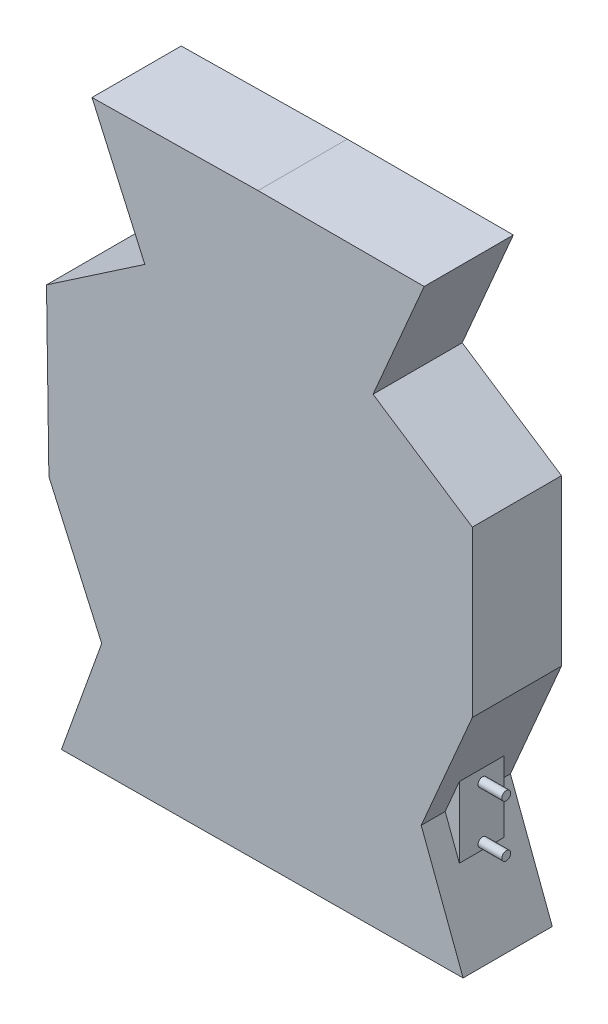
ISO-10303-21;
HEADER;
FILE_DESCRIPTION(('STEP AP214'),'2;1');
FILE_NAME('part.step','',(''),(''),'','','');
FILE_SCHEMA(('AUTOMOTIVE_DESIGN { 1 0 10303 214 1 1 1 1 }'));
ENDSEC;
DATA;
#1=APPLICATION_CONTEXT('core data for automotive mechanical design processes');
#2=APPLICATION_PROTOCOL_DEFINITION('international standard','automotive_design',2000,#1);
#3=PRODUCT_CONTEXT('',#1,'mechanical');
#4=PRODUCT('Part','Part','',(#3));
#5=PRODUCT_RELATED_PRODUCT_CATEGORY('part','',(#4));
#6=PRODUCT_DEFINITION_FORMATION('','',#4);
#7=PRODUCT_DEFINITION_CONTEXT('part definition',#1,'design');
#8=PRODUCT_DEFINITION('design','',#6,#7);
#9=PRODUCT_DEFINITION_SHAPE('','',#8);
#10=(LENGTH_UNIT() NAMED_UNIT(*) SI_UNIT(.MILLI.,.METRE.));
#11=(NAMED_UNIT(*) PLANE_ANGLE_UNIT() SI_UNIT($,.RADIAN.));
#12=(NAMED_UNIT(*) SI_UNIT($,.STERADIAN.) SOLID_ANGLE_UNIT());
#13=UNCERTAINTY_MEASURE_WITH_UNIT(LENGTH_MEASURE(1.E-05),#10,'distance_accuracy_value','');
#14=(GEOMETRIC_REPRESENTATION_CONTEXT(3) GLOBAL_UNCERTAINTY_ASSIGNED_CONTEXT((#13)) GLOBAL_UNIT_ASSIGNED_CONTEXT((#10,
#11,#12)) REPRESENTATION_CONTEXT('',''));
#15=CARTESIAN_POINT('',(0.,0.,0.));
#16=DIRECTION('',(0.,0.,1.));
#17=DIRECTION('',(1.,0.,0.));
#18=AXIS2_PLACEMENT_3D('',#15,#16,#17);
#19=CARTESIAN_POINT('',(19.2258651036182,-108.485610583333,30.));
#20=DIRECTION('',(-0.935884627526308,-0.352306633431652,0.));
#21=DIRECTION('',(0.352306633431652,-0.935884627526308,0.));
#22=AXIS2_PLACEMENT_3D('',#19,#20,#21);
#23=PLANE('',#22);
#24=DIRECTION('',(-0.352306633431652,0.935884627526308,0.));
#25=VECTOR('',#24,1.);
#26=CARTESIAN_POINT('',(19.2258651036182,-108.485610583333,6.94150678656227));
#27=LINE('',#26,#25);
#28=CARTESIAN_POINT('',(24.0000000000001,-121.167856772511,6.94150678656227));
#29=VERTEX_POINT('',#28);
#30=CARTESIAN_POINT('',(19.2258651036182,-108.485610583333,6.94150678656227));
#31=VERTEX_POINT('',#30);
#32=EDGE_CURVE('E231',#29,#31,#27,.T.);
#33=ORIENTED_EDGE('',*,*,#32,.F.);
#34=DIRECTION('',(0.,0.,-1.));
#35=VECTOR('',#34,1.);
#36=CARTESIAN_POINT('',(24.0000000000001,-121.167856772511,30.));
#37=LINE('',#36,#35);
#38=CARTESIAN_POINT('',(24.0000000000001,-121.167856772511,21.9415067865623));
#39=VERTEX_POINT('',#38);
#40=EDGE_CURVE('E217',#39,#29,#37,.T.);
#41=ORIENTED_EDGE('',*,*,#40,.F.);
#42=DIRECTION('',(0.352306633431652,-0.935884627526308,0.));
#43=VECTOR('',#42,1.);
#44=CARTESIAN_POINT('',(19.2258651036182,-108.485610583333,21.9415067865623));
#45=LINE('',#44,#43);
#46=CARTESIAN_POINT('',(19.2258651036182,-108.485610583333,21.9415067865623));
#47=VERTEX_POINT('',#46);
#48=EDGE_CURVE('E225',#47,#39,#45,.T.);
#49=ORIENTED_EDGE('',*,*,#48,.F.);
#50=DIRECTION('',(0.,0.,-1.));
#51=VECTOR('',#50,1.);
#52=CARTESIAN_POINT('',(19.2258651036182,-108.485610583333,30.));
#53=LINE('',#52,#51);
#54=CARTESIAN_POINT('',(19.2258651036182,-108.485610583333,30.));
#55=VERTEX_POINT('',#54);
#56=EDGE_CURVE('E305',#55,#47,#53,.T.);
#57=ORIENTED_EDGE('',*,*,#56,.F.);
#58=DIRECTION('',(-0.352306633431652,0.935884627526308,0.));
#59=VECTOR('',#58,1.);
#60=CARTESIAN_POINT('',(19.2258651036182,-108.485610583333,30.));
#61=LINE('',#60,#59);
#62=CARTESIAN_POINT('',(33.3181304408842,-145.920995684385,30.));
#63=VERTEX_POINT('',#62);
#64=EDGE_CURVE('E250',#63,#55,#61,.T.);
#65=ORIENTED_EDGE('',*,*,#64,.F.);
#66=DIRECTION('',(0.,0.,-1.));
#67=VECTOR('',#66,1.);
#68=CARTESIAN_POINT('',(33.3181304408842,-145.920995684385,30.));
#69=LINE('',#68,#67);
#70=CARTESIAN_POINT('',(33.3181304408842,-145.920995684385,0.));
#71=VERTEX_POINT('',#70);
#72=EDGE_CURVE('E308',#63,#71,#69,.T.);
#73=ORIENTED_EDGE('',*,*,#72,.T.);
#74=DIRECTION('',(-0.352306633431652,0.935884627526308,0.));
#75=VECTOR('',#74,1.);
#76=CARTESIAN_POINT('',(19.2258651036182,-108.485610583333,0.));
#77=LINE('',#76,#75);
#78=CARTESIAN_POINT('',(19.2258651036182,-108.485610583333,0.));
#79=VERTEX_POINT('',#78);
#80=EDGE_CURVE('E278',#71,#79,#77,.T.);
#81=ORIENTED_EDGE('',*,*,#80,.T.);
#82=EDGE_CURVE('E304',#31,#79,#53,.T.);
#83=ORIENTED_EDGE('',*,*,#82,.F.);
#84=EDGE_LOOP('',(#33,#41,#49,#57,#65,#73,#81,#83));
#85=FACE_BOUND('',#84,.T.);
#86=ADVANCED_FACE('F32',(#85),#23,.F.);
#87=CARTESIAN_POINT('',(36.4175876407539,-68.4856105833332,30.));
#88=DIRECTION('',(-0.918738168273325,0.394867291830782,0.));
#89=DIRECTION('',(-0.394867291830782,-0.918738168273325,0.));
#90=AXIS2_PLACEMENT_3D('',#87,#88,#89);
#91=PLANE('',#90);
#92=DIRECTION('',(0.394867291830782,0.918738168273325,0.));
#93=VECTOR('',#92,1.);
#94=CARTESIAN_POINT('',(36.4175876407539,-68.4856105833332,6.94150678656227));
#95=LINE('',#94,#93);
#96=CARTESIAN_POINT('',(24.0000000000001,-97.377625595629,6.94150678656227));
#97=VERTEX_POINT('',#96);
#98=EDGE_CURVE('E184',#31,#97,#95,.T.);
#99=ORIENTED_EDGE('',*,*,#98,.F.);
#100=ORIENTED_EDGE('',*,*,#82,.T.);
#101=DIRECTION('',(0.394867291830782,0.918738168273325,0.));
#102=VECTOR('',#101,1.);
#103=CARTESIAN_POINT('',(36.4175876407539,-68.4856105833332,0.));
#104=LINE('',#103,#102);
#105=CARTESIAN_POINT('',(36.4175876407539,-68.4856105833332,0.));
#106=VERTEX_POINT('',#105);
#107=EDGE_CURVE('E281',#79,#106,#104,.T.);
#108=ORIENTED_EDGE('',*,*,#107,.T.);
#109=DIRECTION('',(0.,0.,-1.));
#110=VECTOR('',#109,1.);
#111=CARTESIAN_POINT('',(36.4175876407539,-68.4856105833332,30.));
#112=LINE('',#111,#110);
#113=CARTESIAN_POINT('',(36.4175876407539,-68.4856105833332,30.));
#114=VERTEX_POINT('',#113);
#115=EDGE_CURVE('E301',#114,#106,#112,.T.);
#116=ORIENTED_EDGE('',*,*,#115,.F.);
#117=DIRECTION('',(0.394867291830782,0.918738168273325,0.));
#118=VECTOR('',#117,1.);
#119=CARTESIAN_POINT('',(36.4175876407539,-68.4856105833332,30.));
#120=LINE('',#119,#118);
#121=EDGE_CURVE('E252',#55,#114,#120,.T.);
#122=ORIENTED_EDGE('',*,*,#121,.F.);
#123=ORIENTED_EDGE('',*,*,#56,.T.);
#124=DIRECTION('',(-0.394867291830782,-0.918738168273325,0.));
#125=VECTOR('',#124,1.);
#126=CARTESIAN_POINT('',(36.4175876407539,-68.4856105833332,21.9415067865623));
#127=LINE('',#126,#125);
#128=CARTESIAN_POINT('',(24.0000000000001,-97.377625595629,21.9415067865623));
#129=VERTEX_POINT('',#128);
#130=EDGE_CURVE('E189',#129,#47,#127,.T.);
#131=ORIENTED_EDGE('',*,*,#130,.F.);
#132=DIRECTION('',(0.,0.,1.));
#133=VECTOR('',#132,1.);
#134=CARTESIAN_POINT('',(24.0000000000001,-97.377625595629,30.));
#135=LINE('',#134,#133);
#136=EDGE_CURVE('E219',#97,#129,#135,.T.);
#137=ORIENTED_EDGE('',*,*,#136,.F.);
#138=EDGE_LOOP('',(#99,#100,#108,#116,#122,#123,#131,#137));
#139=FACE_BOUND('',#138,.T.);
#140=ADVANCED_FACE('F326',(#139),#91,.F.);
#141=CARTESIAN_POINT('',(-91.5246396923902,48.1857808875972,30.));
#142=DIRECTION('',(0.0144687106700426,-0.999895322727107,0.));
#143=DIRECTION('',(0.999895322727108,0.0144687106700426,0.));
#144=AXIS2_PLACEMENT_3D('',#141,#142,#143);
#145=PLANE('',#144);
#146=DIRECTION('',(-0.999895322727107,-0.0144687106700426,0.));
#147=VECTOR('',#146,1.);
#148=CARTESIAN_POINT('',(-91.5246396923902,48.1857808875972,0.));
#149=LINE('',#148,#147);
#150=CARTESIAN_POINT('',(-35.6592204405538,48.9941660947716,0.));
#151=VERTEX_POINT('',#150);
#152=CARTESIAN_POINT('',(-91.5246396923902,48.1857808875972,0.));
#153=VERTEX_POINT('',#152);
#154=EDGE_CURVE('E234',#151,#153,#149,.T.);
#155=ORIENTED_EDGE('',*,*,#154,.T.);
#156=DIRECTION('',(0.,0.,-1.));
#157=VECTOR('',#156,1.);
#158=CARTESIAN_POINT('',(-91.5246396923902,48.1857808875972,30.));
#159=LINE('',#158,#157);
#160=CARTESIAN_POINT('',(-91.5246396923902,48.1857808875972,30.));
#161=VERTEX_POINT('',#160);
#162=EDGE_CURVE('E322',#161,#153,#159,.T.);
#163=ORIENTED_EDGE('',*,*,#162,.F.);
#164=DIRECTION('',(-0.999895322727107,-0.0144687106700426,0.));
#165=VECTOR('',#164,1.);
#166=CARTESIAN_POINT('',(-91.5246396923902,48.1857808875972,30.));
#167=LINE('',#166,#165);
#168=CARTESIAN_POINT('',(-35.6592204405538,48.9941660947716,30.));
#169=VERTEX_POINT('',#168);
#170=EDGE_CURVE('E235',#169,#161,#167,.T.);
#171=ORIENTED_EDGE('',*,*,#170,.F.);
#172=DIRECTION('',(0.,0.,-1.));
#173=VECTOR('',#172,1.);
#174=CARTESIAN_POINT('',(-35.6592204405538,48.9941660947716,30.));
#175=LINE('',#174,#173);
#176=EDGE_CURVE('E262',#169,#151,#175,.T.);
#177=ORIENTED_EDGE('',*,*,#176,.T.);
#178=EDGE_LOOP('',(#155,#163,#171,#177));
#179=FACE_BOUND('',#178,.T.);
#180=ADVANCED_FACE('F34',(#179),#145,.F.);
#181=CARTESIAN_POINT('',(-91.5246396923902,48.1857808875972,30.));
#182=DIRECTION('',(0.912928776668804,0.408118914937791,0.));
#183=DIRECTION('',(-0.408118914937791,0.912928776668805,0.));
#184=AXIS2_PLACEMENT_3D('',#181,#182,#183);
#185=PLANE('',#184);
#186=DIRECTION('',(0.408118914937791,-0.912928776668804,0.));
#187=VECTOR('',#186,1.);
#188=CARTESIAN_POINT('',(-91.5246396923902,48.1857808875972,0.));
#189=LINE('',#188,#187);
#190=CARTESIAN_POINT('',(-73.7559683110842,8.43871003782237,0.));
#191=VERTEX_POINT('',#190);
#192=EDGE_CURVE('E265',#153,#191,#189,.T.);
#193=ORIENTED_EDGE('',*,*,#192,.T.);
#194=DIRECTION('',(0.,0.,-1.));
#195=VECTOR('',#194,1.);
#196=CARTESIAN_POINT('',(-73.7559683110842,8.43871003782237,30.));
#197=LINE('',#196,#195);
#198=CARTESIAN_POINT('',(-73.7559683110842,8.43871003782237,30.));
#199=VERTEX_POINT('',#198);
#200=EDGE_CURVE('E319',#199,#191,#197,.T.);
#201=ORIENTED_EDGE('',*,*,#200,.F.);
#202=DIRECTION('',(0.408118914937791,-0.912928776668804,0.));
#203=VECTOR('',#202,1.);
#204=CARTESIAN_POINT('',(-91.5246396923902,48.1857808875972,30.));
#205=LINE('',#204,#203);
#206=EDGE_CURVE('E238',#161,#199,#205,.T.);
#207=ORIENTED_EDGE('',*,*,#206,.F.);
#208=ORIENTED_EDGE('',*,*,#162,.T.);
#209=EDGE_LOOP('',(#193,#201,#207,#208));
#210=FACE_BOUND('',#209,.T.);
#211=ADVANCED_FACE('F375',(#210),#185,.F.);
#212=CARTESIAN_POINT('',(-73.7559683110842,8.43871003782237,30.));
#213=DIRECTION('',(0.562376540625002,-0.82688126508868,0.));
#214=DIRECTION('',(0.82688126508868,0.562376540625002,0.));
#215=AXIS2_PLACEMENT_3D('',#212,#213,#214);
#216=PLANE('',#215);
#217=DIRECTION('',(-0.82688126508868,-0.562376540625002,0.));
#218=VECTOR('',#217,1.);
#219=CARTESIAN_POINT('',(-73.7559683110842,8.43871003782237,0.));
#220=LINE('',#219,#218);
#221=CARTESIAN_POINT('',(-106.831218914631,-14.0563515871777,0.));
#222=VERTEX_POINT('',#221);
#223=EDGE_CURVE('E267',#191,#222,#220,.T.);
#224=ORIENTED_EDGE('',*,*,#223,.T.);
#225=DIRECTION('',(0.,0.,-1.));
#226=VECTOR('',#225,1.);
#227=CARTESIAN_POINT('',(-106.831218914631,-14.0563515871777,30.));
#228=LINE('',#227,#226);
#229=CARTESIAN_POINT('',(-106.831218914631,-14.0563515871777,30.));
#230=VERTEX_POINT('',#229);
#231=EDGE_CURVE('E316',#230,#222,#228,.T.);
#232=ORIENTED_EDGE('',*,*,#231,.F.);
#233=DIRECTION('',(-0.82688126508868,-0.562376540625002,0.));
#234=VECTOR('',#233,1.);
#235=CARTESIAN_POINT('',(-73.7559683110842,8.43871003782237,30.));
#236=LINE('',#235,#234);
#237=EDGE_CURVE('E241',#199,#230,#236,.T.);
#238=ORIENTED_EDGE('',*,*,#237,.F.);
#239=ORIENTED_EDGE('',*,*,#200,.T.);
#240=EDGE_LOOP('',(#224,#232,#238,#239));
#241=FACE_BOUND('',#240,.T.);
#242=ADVANCED_FACE('F371',(#241),#216,.F.);
#243=CARTESIAN_POINT('',(-106.831218914631,-14.0563515871777,30.));
#244=DIRECTION('',(0.999895322727108,0.0144687106700407,0.));
#245=DIRECTION('',(-0.0144687106700407,0.999895322727108,0.));
#246=AXIS2_PLACEMENT_3D('',#243,#244,#245);
#247=PLANE('',#246);
#248=DIRECTION('',(0.0144687106700407,-0.999895322727108,0.));
#249=VECTOR('',#248,1.);
#250=CARTESIAN_POINT('',(-106.831218914631,-14.0563515871777,0.));
#251=LINE('',#250,#249);
#252=CARTESIAN_POINT('',(-106.028702819816,-69.5161716028391,0.));
#253=VERTEX_POINT('',#252);
#254=EDGE_CURVE('E269',#222,#253,#251,.T.);
#255=ORIENTED_EDGE('',*,*,#254,.T.);
#256=DIRECTION('',(0.,0.,-1.));
#257=VECTOR('',#256,1.);
#258=CARTESIAN_POINT('',(-106.028702819816,-69.5161716028391,30.));
#259=LINE('',#258,#257);
#260=CARTESIAN_POINT('',(-106.028702819816,-69.5161716028391,30.));
#261=VERTEX_POINT('',#260);
#262=EDGE_CURVE('E171',#261,#253,#259,.T.);
#263=ORIENTED_EDGE('',*,*,#262,.F.);
#264=DIRECTION('',(0.0144687106700407,-0.999895322727108,0.));
#265=VECTOR('',#264,1.);
#266=CARTESIAN_POINT('',(-106.831218914631,-14.0563515871777,30.));
#267=LINE('',#266,#265);
#268=EDGE_CURVE('E243',#230,#261,#267,.T.);
#269=ORIENTED_EDGE('',*,*,#268,.F.);
#270=ORIENTED_EDGE('',*,*,#231,.T.);
#271=EDGE_LOOP('',(#255,#263,#269,#270));
#272=FACE_BOUND('',#271,.T.);
#273=ADVANCED_FACE('F367',(#272),#247,.F.);
#274=CARTESIAN_POINT('',(-106.028702819816,-69.5161716028391,30.));
#275=DIRECTION('',(0.912928776668805,0.408118914937791,0.));
#276=DIRECTION('',(-0.408118914937791,0.912928776668805,0.));
#277=AXIS2_PLACEMENT_3D('',#274,#275,#276);
#278=PLANE('',#277);
#279=DIRECTION('',(0.,0.,-1.));
#280=VECTOR('',#279,1.);
#281=CARTESIAN_POINT('',(-88.2600314385101,-109.263242452614,30.));
#282=LINE('',#281,#280);
#283=CARTESIAN_POINT('',(-88.2600314385101,-109.263242452614,5.));
#284=VERTEX_POINT('',#283);
#285=CARTESIAN_POINT('',(-88.2600314385101,-109.263242452614,0.));
#286=VERTEX_POINT('',#285);
#287=EDGE_CURVE('E172',#284,#286,#282,.T.);
#288=ORIENTED_EDGE('',*,*,#287,.F.);
#289=DIRECTION('',(-0.408118914937791,0.912928776668805,0.));
#290=VECTOR('',#289,1.);
#291=CARTESIAN_POINT('',(-106.028702819816,-69.5161716028391,5.));
#292=LINE('',#291,#290);
#293=CARTESIAN_POINT('',(-92.4910494391389,-99.7987997473144,5.));
#294=VERTEX_POINT('',#293);
#295=EDGE_CURVE('E47',#284,#294,#292,.T.);
#296=ORIENTED_EDGE('',*,*,#295,.T.);
#297=DIRECTION('',(0.,0.,-1.));
#298=VECTOR('',#297,1.);
#299=CARTESIAN_POINT('',(-92.4910494391389,-99.7987997473144,30.));
#300=LINE('',#299,#298);
#301=CARTESIAN_POINT('',(-92.4910494391389,-99.7987997473144,25.));
#302=VERTEX_POINT('',#301);
#303=EDGE_CURVE('E51',#302,#294,#300,.T.);
#304=ORIENTED_EDGE('',*,*,#303,.F.);
#305=DIRECTION('',(-0.408118914937791,0.912928776668805,0.));
#306=VECTOR('',#305,1.);
#307=CARTESIAN_POINT('',(-106.028702819816,-69.5161716028391,25.));
#308=LINE('',#307,#306);
#309=CARTESIAN_POINT('',(-88.2600314385101,-109.263242452614,25.));
#310=VERTEX_POINT('',#309);
#311=EDGE_CURVE('E174',#310,#302,#308,.T.);
#312=ORIENTED_EDGE('',*,*,#311,.F.);
#313=CARTESIAN_POINT('',(-88.2600314385101,-109.263242452614,30.));
#314=VERTEX_POINT('',#313);
#315=EDGE_CURVE('E163',#314,#310,#282,.T.);
#316=ORIENTED_EDGE('',*,*,#315,.F.);
#317=DIRECTION('',(0.408118914937791,-0.912928776668805,0.));
#318=VECTOR('',#317,1.);
#319=CARTESIAN_POINT('',(-106.028702819816,-69.5161716028391,30.));
#320=LINE('',#319,#318);
#321=EDGE_CURVE('E245',#261,#314,#320,.T.);
#322=ORIENTED_EDGE('',*,*,#321,.F.);
#323=ORIENTED_EDGE('',*,*,#262,.T.);
#324=DIRECTION('',(0.408118914937791,-0.912928776668805,0.));
#325=VECTOR('',#324,1.);
#326=CARTESIAN_POINT('',(-106.028702819816,-69.5161716028391,0.));
#327=LINE('',#326,#325);
#328=EDGE_CURVE('E271',#253,#286,#327,.T.);
#329=ORIENTED_EDGE('',*,*,#328,.T.);
#330=EDGE_LOOP('',(#288,#296,#304,#312,#316,#322,#323,#329));
#331=FACE_BOUND('',#330,.T.);
#332=ADVANCED_FACE('F175',(#331),#278,.F.);
#333=CARTESIAN_POINT('',(-88.2600314385101,-109.263242452614,30.));
#334=DIRECTION('',(0.940884084422016,-0.338728711037824,0.));
#335=DIRECTION('',(0.338728711037824,0.940884084422016,0.));
#336=AXIS2_PLACEMENT_3D('',#333,#334,#335);
#337=PLANE('',#336);
#338=DIRECTION('',(0.,0.,1.));
#339=VECTOR('',#338,1.);
#340=CARTESIAN_POINT('',(-92.4910494391389,-121.015707974352,30.));
#341=LINE('',#340,#339);
#342=CARTESIAN_POINT('',(-92.4910494391389,-121.015707974352,5.));
#343=VERTEX_POINT('',#342);
#344=CARTESIAN_POINT('',(-92.4910494391389,-121.015707974352,25.));
#345=VERTEX_POINT('',#344);
#346=EDGE_CURVE('E183',#343,#345,#341,.T.);
#347=ORIENTED_EDGE('',*,*,#346,.F.);
#348=DIRECTION('',(0.338728711037824,0.940884084422016,0.));
#349=VECTOR('',#348,1.);
#350=CARTESIAN_POINT('',(-88.2600314385101,-109.263242452614,5.));
#351=LINE('',#350,#349);
#352=EDGE_CURVE('E186',#343,#284,#351,.T.);
#353=ORIENTED_EDGE('',*,*,#352,.T.);
#354=ORIENTED_EDGE('',*,*,#287,.T.);
#355=DIRECTION('',(-0.338728711037824,-0.940884084422016,0.));
#356=VECTOR('',#355,1.);
#357=CARTESIAN_POINT('',(-88.2600314385101,-109.263242452614,0.));
#358=LINE('',#357,#356);
#359=CARTESIAN_POINT('',(-101.809179880023,-146.898605829495,0.));
#360=VERTEX_POINT('',#359);
#361=EDGE_CURVE('E274',#286,#360,#358,.T.);
#362=ORIENTED_EDGE('',*,*,#361,.T.);
#363=DIRECTION('',(0.,0.,-1.));
#364=VECTOR('',#363,1.);
#365=CARTESIAN_POINT('',(-101.809179880023,-146.898605829495,30.));
#366=LINE('',#365,#364);
#367=CARTESIAN_POINT('',(-101.809179880023,-146.898605829495,30.));
#368=VERTEX_POINT('',#367);
#369=EDGE_CURVE('E311',#368,#360,#366,.T.);
#370=ORIENTED_EDGE('',*,*,#369,.F.);
#371=DIRECTION('',(-0.338728711037824,-0.940884084422016,0.));
#372=VECTOR('',#371,1.);
#373=CARTESIAN_POINT('',(-88.2600314385101,-109.263242452614,30.));
#374=LINE('',#373,#372);
#375=EDGE_CURVE('E169',#314,#368,#374,.T.);
#376=ORIENTED_EDGE('',*,*,#375,.F.);
#377=ORIENTED_EDGE('',*,*,#315,.T.);
#378=DIRECTION('',(0.338728711037824,0.940884084422016,0.));
#379=VECTOR('',#378,1.);
#380=CARTESIAN_POINT('',(-88.2600314385101,-109.263242452614,25.));
#381=LINE('',#380,#379);
#382=EDGE_CURVE('E166',#345,#310,#381,.T.);
#383=ORIENTED_EDGE('',*,*,#382,.F.);
#384=EDGE_LOOP('',(#347,#353,#354,#362,#370,#376,#377,#383));
#385=FACE_BOUND('',#384,.T.);
#386=ADVANCED_FACE('F164',(#385),#337,.F.);
#387=CARTESIAN_POINT('',(-101.809179880023,-146.898605829495,30.));
#388=DIRECTION('',(-0.00723454466060004,0.999973830339351,0.));
#389=DIRECTION('',(-0.999973830339351,-0.00723454466060004,0.));
#390=AXIS2_PLACEMENT_3D('',#387,#388,#389);
#391=PLANE('',#390);
#392=DIRECTION('',(0.999973830339351,0.00723454466060004,0.));
#393=VECTOR('',#392,1.);
#394=CARTESIAN_POINT('',(-101.809179880023,-146.898605829495,0.));
#395=LINE('',#394,#393);
#396=EDGE_CURVE('E276',#360,#71,#395,.T.);
#397=ORIENTED_EDGE('',*,*,#396,.T.);
#398=ORIENTED_EDGE('',*,*,#72,.F.);
#399=DIRECTION('',(0.999973830339351,0.00723454466060004,0.));
#400=VECTOR('',#399,1.);
#401=CARTESIAN_POINT('',(-101.809179880023,-146.898605829495,30.));
#402=LINE('',#401,#400);
#403=EDGE_CURVE('E248',#368,#63,#402,.T.);
#404=ORIENTED_EDGE('',*,*,#403,.F.);
#405=ORIENTED_EDGE('',*,*,#369,.T.);
#406=EDGE_LOOP('',(#397,#398,#404,#405));
#407=FACE_BOUND('',#406,.T.);
#408=ADVANCED_FACE('F359',(#407),#391,.F.);
#409=CARTESIAN_POINT('',(36.4175876407538,-13.0199845772022,30.));
#410=DIRECTION('',(-1.,0.,0.));
#411=DIRECTION('',(0.,-1.,0.));
#412=AXIS2_PLACEMENT_3D('',#409,#410,#411);
#413=PLANE('',#412);
#414=DIRECTION('',(0.,1.,0.));
#415=VECTOR('',#414,1.);
#416=CARTESIAN_POINT('',(36.4175876407538,-13.0199845772022,0.));
#417=LINE('',#416,#415);
#418=CARTESIAN_POINT('',(36.4175876407538,-13.0199845772022,0.));
#419=VERTEX_POINT('',#418);
#420=EDGE_CURVE('E283',#106,#419,#417,.T.);
#421=ORIENTED_EDGE('',*,*,#420,.T.);
#422=DIRECTION('',(0.,0.,-1.));
#423=VECTOR('',#422,1.);
#424=CARTESIAN_POINT('',(36.4175876407538,-13.0199845772022,30.));
#425=LINE('',#424,#423);
#426=CARTESIAN_POINT('',(36.4175876407538,-13.0199845772022,30.));
#427=VERTEX_POINT('',#426);
#428=EDGE_CURVE('E298',#427,#419,#425,.T.);
#429=ORIENTED_EDGE('',*,*,#428,.F.);
#430=DIRECTION('',(0.,1.,0.));
#431=VECTOR('',#430,1.);
#432=CARTESIAN_POINT('',(36.4175876407538,-13.0199845772022,30.));
#433=LINE('',#432,#431);
#434=EDGE_CURVE('E254',#114,#427,#433,.T.);
#435=ORIENTED_EDGE('',*,*,#434,.F.);
#436=ORIENTED_EDGE('',*,*,#115,.T.);
#437=EDGE_LOOP('',(#421,#429,#435,#436));
#438=FACE_BOUND('',#437,.T.);
#439=ADVANCED_FACE('F347',(#438),#413,.F.);
#440=CARTESIAN_POINT('',(3.02032472608309,8.99416609477159,30.));
#441=DIRECTION('',(-0.550353766799344,-0.834931572866767,0.));
#442=DIRECTION('',(0.834931572866767,-0.550353766799344,0.));
#443=AXIS2_PLACEMENT_3D('',#440,#441,#442);
#444=PLANE('',#443);
#445=DIRECTION('',(-0.834931572866767,0.550353766799344,0.));
#446=VECTOR('',#445,1.);
#447=CARTESIAN_POINT('',(3.02032472608309,8.99416609477159,0.));
#448=LINE('',#447,#446);
#449=CARTESIAN_POINT('',(3.02032472608309,8.99416609477159,0.));
#450=VERTEX_POINT('',#449);
#451=EDGE_CURVE('E285',#419,#450,#448,.T.);
#452=ORIENTED_EDGE('',*,*,#451,.T.);
#453=DIRECTION('',(0.,0.,-1.));
#454=VECTOR('',#453,1.);
#455=CARTESIAN_POINT('',(3.02032472608309,8.99416609477159,30.));
#456=LINE('',#455,#454);
#457=CARTESIAN_POINT('',(3.02032472608309,8.99416609477159,30.));
#458=VERTEX_POINT('',#457);
#459=EDGE_CURVE('E295',#458,#450,#456,.T.);
#460=ORIENTED_EDGE('',*,*,#459,.F.);
#461=DIRECTION('',(-0.834931572866767,0.550353766799344,0.));
#462=VECTOR('',#461,1.);
#463=CARTESIAN_POINT('',(3.02032472608309,8.99416609477159,30.));
#464=LINE('',#463,#462);
#465=EDGE_CURVE('E256',#427,#458,#464,.T.);
#466=ORIENTED_EDGE('',*,*,#465,.F.);
#467=ORIENTED_EDGE('',*,*,#428,.T.);
#468=EDGE_LOOP('',(#452,#460,#466,#467));
#469=FACE_BOUND('',#468,.T.);
#470=ADVANCED_FACE('F351',(#469),#444,.F.);
#471=CARTESIAN_POINT('',(20.2120472632188,48.9941660947716,30.));
#472=DIRECTION('',(-0.918738168273324,0.394867291830783,0.));
#473=DIRECTION('',(-0.394867291830783,-0.918738168273325,0.));
#474=AXIS2_PLACEMENT_3D('',#471,#472,#473);
#475=PLANE('',#474);
#476=DIRECTION('',(0.394867291830783,0.918738168273324,0.));
#477=VECTOR('',#476,1.);
#478=CARTESIAN_POINT('',(20.2120472632188,48.9941660947716,0.));
#479=LINE('',#478,#477);
#480=CARTESIAN_POINT('',(20.2120472632188,48.9941660947716,0.));
#481=VERTEX_POINT('',#480);
#482=EDGE_CURVE('E287',#450,#481,#479,.T.);
#483=ORIENTED_EDGE('',*,*,#482,.T.);
#484=DIRECTION('',(0.,0.,-1.));
#485=VECTOR('',#484,1.);
#486=CARTESIAN_POINT('',(20.2120472632188,48.9941660947716,30.));
#487=LINE('',#486,#485);
#488=CARTESIAN_POINT('',(20.2120472632188,48.9941660947716,30.));
#489=VERTEX_POINT('',#488);
#490=EDGE_CURVE('E292',#489,#481,#487,.T.);
#491=ORIENTED_EDGE('',*,*,#490,.F.);
#492=DIRECTION('',(0.394867291830783,0.918738168273324,0.));
#493=VECTOR('',#492,1.);
#494=CARTESIAN_POINT('',(20.2120472632188,48.9941660947716,30.));
#495=LINE('',#494,#493);
#496=EDGE_CURVE('E258',#458,#489,#495,.T.);
#497=ORIENTED_EDGE('',*,*,#496,.F.);
#498=ORIENTED_EDGE('',*,*,#459,.T.);
#499=EDGE_LOOP('',(#483,#491,#497,#498));
#500=FACE_BOUND('',#499,.T.);
#501=ADVANCED_FACE('F385',(#500),#475,.F.);
#502=CARTESIAN_POINT('',(-35.6592204405538,48.9941660947716,30.));
#503=DIRECTION('',(0.,-1.,0.));
#504=DIRECTION('',(0.,0.,-1.));
#505=AXIS2_PLACEMENT_3D('',#502,#503,#504);
#506=PLANE('',#505);
#507=DIRECTION('',(-1.,0.,0.));
#508=VECTOR('',#507,1.);
#509=CARTESIAN_POINT('',(-35.6592204405538,48.9941660947716,0.));
#510=LINE('',#509,#508);
#511=EDGE_CURVE('E239',#481,#151,#510,.T.);
#512=ORIENTED_EDGE('',*,*,#511,.T.);
#513=ORIENTED_EDGE('',*,*,#176,.F.);
#514=DIRECTION('',(-1.,0.,0.));
#515=VECTOR('',#514,1.);
#516=CARTESIAN_POINT('',(-35.6592204405538,48.9941660947716,30.));
#517=LINE('',#516,#515);
#518=EDGE_CURVE('E260',#489,#169,#517,.T.);
#519=ORIENTED_EDGE('',*,*,#518,.F.);
#520=ORIENTED_EDGE('',*,*,#490,.T.);
#521=EDGE_LOOP('',(#512,#513,#519,#520));
#522=FACE_BOUND('',#521,.T.);
#523=ADVANCED_FACE('F382',(#522),#506,.F.);
#524=CARTESIAN_POINT('',(0.,0.,30.));
#525=DIRECTION('',(0.,0.,-1.));
#526=DIRECTION('',(-1.,0.,0.));
#527=AXIS2_PLACEMENT_3D('',#524,#525,#526);
#528=PLANE('',#527);
#529=ORIENTED_EDGE('',*,*,#170,.T.);
#530=ORIENTED_EDGE('',*,*,#206,.T.);
#531=ORIENTED_EDGE('',*,*,#237,.T.);
#532=ORIENTED_EDGE('',*,*,#268,.T.);
#533=ORIENTED_EDGE('',*,*,#321,.T.);
#534=ORIENTED_EDGE('',*,*,#375,.T.);
#535=ORIENTED_EDGE('',*,*,#403,.T.);
#536=ORIENTED_EDGE('',*,*,#64,.T.);
#537=ORIENTED_EDGE('',*,*,#121,.T.);
#538=ORIENTED_EDGE('',*,*,#434,.T.);
#539=ORIENTED_EDGE('',*,*,#465,.T.);
#540=ORIENTED_EDGE('',*,*,#496,.T.);
#541=ORIENTED_EDGE('',*,*,#518,.T.);
#542=EDGE_LOOP('',(#529,#530,#531,#532,#533,#534,#535,#536,#537,#538,#539,#540,#541));
#543=FACE_BOUND('',#542,.T.);
#544=ADVANCED_FACE('F355',(#543),#528,.F.);
#545=CARTESIAN_POINT('',(0.,0.,0.));
#546=DIRECTION('',(0.,0.,-1.));
#547=DIRECTION('',(-1.,0.,0.));
#548=AXIS2_PLACEMENT_3D('',#545,#546,#547);
#549=PLANE('',#548);
#550=ORIENTED_EDGE('',*,*,#154,.F.);
#551=ORIENTED_EDGE('',*,*,#511,.F.);
#552=ORIENTED_EDGE('',*,*,#482,.F.);
#553=ORIENTED_EDGE('',*,*,#451,.F.);
#554=ORIENTED_EDGE('',*,*,#420,.F.);
#555=ORIENTED_EDGE('',*,*,#107,.F.);
#556=ORIENTED_EDGE('',*,*,#80,.F.);
#557=ORIENTED_EDGE('',*,*,#396,.F.);
#558=ORIENTED_EDGE('',*,*,#361,.F.);
#559=ORIENTED_EDGE('',*,*,#328,.F.);
#560=ORIENTED_EDGE('',*,*,#254,.F.);
#561=ORIENTED_EDGE('',*,*,#223,.F.);
#562=ORIENTED_EDGE('',*,*,#192,.F.);
#563=EDGE_LOOP('',(#550,#551,#552,#553,#554,#555,#556,#557,#558,#559,#560,#561,#562));
#564=FACE_BOUND('',#563,.T.);
#565=ADVANCED_FACE('F342',(#564),#549,.T.);
#566=CARTESIAN_POINT('',(24.0000000000001,-93.5713704018408,6.94150678656227));
#567=DIRECTION('',(0.,0.,1.));
#568=DIRECTION('',(0.,-1.,0.));
#569=AXIS2_PLACEMENT_3D('',#566,#567,#568);
#570=PLANE('',#569);
#571=DIRECTION('',(0.,1.,0.));
#572=VECTOR('',#571,1.);
#573=CARTESIAN_POINT('',(24.0000000000001,-93.5713704018408,6.94150678656227));
#574=LINE('',#573,#572);
#575=EDGE_CURVE('E223',#29,#97,#574,.T.);
#576=ORIENTED_EDGE('',*,*,#575,.F.);
#577=ORIENTED_EDGE('',*,*,#32,.T.);
#578=ORIENTED_EDGE('',*,*,#98,.T.);
#579=EDGE_LOOP('',(#576,#577,#578));
#580=FACE_BOUND('',#579,.T.);
#581=ADVANCED_FACE('F334',(#580),#570,.F.);
#582=CARTESIAN_POINT('',(24.0000000000001,-93.5713704018408,21.9415067865623));
#583=DIRECTION('',(0.,0.,-1.));
#584=DIRECTION('',(0.,1.,0.));
#585=AXIS2_PLACEMENT_3D('',#582,#583,#584);
#586=PLANE('',#585);
#587=ORIENTED_EDGE('',*,*,#130,.T.);
#588=ORIENTED_EDGE('',*,*,#48,.T.);
#589=DIRECTION('',(0.,-1.,0.));
#590=VECTOR('',#589,1.);
#591=CARTESIAN_POINT('',(24.0000000000001,-93.5713704018408,21.9415067865623));
#592=LINE('',#591,#590);
#593=EDGE_CURVE('E215',#129,#39,#592,.T.);
#594=ORIENTED_EDGE('',*,*,#593,.F.);
#595=EDGE_LOOP('',(#587,#588,#594));
#596=FACE_BOUND('',#595,.T.);
#597=ADVANCED_FACE('F208',(#596),#586,.F.);
#598=CARTESIAN_POINT('',(24.0000000000001,0.,0.));
#599=DIRECTION('',(-1.,0.,0.));
#600=DIRECTION('',(0.,0.,1.));
#601=AXIS2_PLACEMENT_3D('',#598,#599,#600);
#602=PLANE('',#601);
#603=CARTESIAN_POINT('',(24.0000000000001,-101.373718374154,14.163706184612));
#604=DIRECTION('',(-1.,0.,0.));
#605=DIRECTION('',(0.,0.,1.));
#606=AXIS2_PLACEMENT_3D('',#603,#604,#605);
#607=CIRCLE('',#606,1.5);
#608=CARTESIAN_POINT('',(24.0000000000001,-101.373718374154,15.6637061846121));
#609=VERTEX_POINT('',#608);
#610=EDGE_CURVE('E11',#609,#609,#607,.F.);
#611=ORIENTED_EDGE('',*,*,#610,.F.);
#612=EDGE_LOOP('',(#611));
#613=FACE_BOUND('',#612,.T.);
#614=CARTESIAN_POINT('',(24.0000000000001,-118.873718374154,14.163706184612));
#615=DIRECTION('',(-1.,0.,0.));
#616=DIRECTION('',(0.,0.,1.));
#617=AXIS2_PLACEMENT_3D('',#614,#615,#616);
#618=CIRCLE('',#617,1.5);
#619=CARTESIAN_POINT('',(24.0000000000001,-118.873718374154,15.6637061846121));
#620=VERTEX_POINT('',#619);
#621=EDGE_CURVE('E40',#620,#620,#618,.F.);
#622=ORIENTED_EDGE('',*,*,#621,.F.);
#623=EDGE_LOOP('',(#622));
#624=FACE_BOUND('',#623,.T.);
#625=ORIENTED_EDGE('',*,*,#593,.T.);
#626=ORIENTED_EDGE('',*,*,#40,.T.);
#627=ORIENTED_EDGE('',*,*,#575,.T.);
#628=ORIENTED_EDGE('',*,*,#136,.T.);
#629=EDGE_LOOP('',(#625,#626,#627,#628));
#630=FACE_BOUND('',#629,.T.);
#631=ADVANCED_FACE('F204',(#613,#624,#630),#602,.F.);
#632=CARTESIAN_POINT('',(-92.4910494391389,-121.167856772511,5.));
#633=DIRECTION('',(1.,0.,0.));
#634=DIRECTION('',(0.,0.,-1.));
#635=AXIS2_PLACEMENT_3D('',#632,#633,#634);
#636=PLANE('',#635);
#637=CARTESIAN_POINT('',(-92.4910494391389,-118.873718374154,14.163706184612));
#638=DIRECTION('',(1.,0.,0.));
#639=DIRECTION('',(0.,0.,-1.));
#640=AXIS2_PLACEMENT_3D('',#637,#638,#639);
#641=CIRCLE('',#640,1.5);
#642=CARTESIAN_POINT('',(-92.4910494391389,-118.873718374154,12.663706184612));
#643=VERTEX_POINT('',#642);
#644=EDGE_CURVE('E197',#643,#643,#641,.F.);
#645=ORIENTED_EDGE('',*,*,#644,.F.);
#646=EDGE_LOOP('',(#645));
#647=FACE_BOUND('',#646,.T.);
#648=CARTESIAN_POINT('',(-92.4910494391389,-101.373718374154,14.163706184612));
#649=DIRECTION('',(1.,0.,0.));
#650=DIRECTION('',(0.,0.,-1.));
#651=AXIS2_PLACEMENT_3D('',#648,#649,#650);
#652=CIRCLE('',#651,1.5);
#653=CARTESIAN_POINT('',(-92.4910494391389,-101.373718374154,12.663706184612));
#654=VERTEX_POINT('',#653);
#655=EDGE_CURVE('E194',#654,#654,#652,.F.);
#656=ORIENTED_EDGE('',*,*,#655,.F.);
#657=EDGE_LOOP('',(#656));
#658=FACE_BOUND('',#657,.T.);
#659=DIRECTION('',(0.,1.,0.));
#660=VECTOR('',#659,1.);
#661=CARTESIAN_POINT('',(-92.4910494391389,-121.167856772511,25.));
#662=LINE('',#661,#660);
#663=EDGE_CURVE('E182',#345,#302,#662,.T.);
#664=ORIENTED_EDGE('',*,*,#663,.T.);
#665=ORIENTED_EDGE('',*,*,#303,.T.);
#666=DIRECTION('',(0.,1.,0.));
#667=VECTOR('',#666,1.);
#668=CARTESIAN_POINT('',(-92.4910494391389,-121.167856772511,5.));
#669=LINE('',#668,#667);
#670=EDGE_CURVE('E179',#343,#294,#669,.T.);
#671=ORIENTED_EDGE('',*,*,#670,.F.);
#672=ORIENTED_EDGE('',*,*,#346,.T.);
#673=EDGE_LOOP('',(#664,#665,#671,#672));
#674=FACE_BOUND('',#673,.T.);
#675=ADVANCED_FACE('F207',(#647,#658,#674),#636,.F.);
#676=CARTESIAN_POINT('',(0.,0.,5.));
#677=DIRECTION('',(0.,0.,-1.));
#678=DIRECTION('',(-1.,0.,0.));
#679=AXIS2_PLACEMENT_3D('',#676,#677,#678);
#680=PLANE('',#679);
#681=ORIENTED_EDGE('',*,*,#295,.F.);
#682=ORIENTED_EDGE('',*,*,#352,.F.);
#683=ORIENTED_EDGE('',*,*,#670,.T.);
#684=EDGE_LOOP('',(#681,#682,#683));
#685=FACE_BOUND('',#684,.T.);
#686=ADVANCED_FACE('F462',(#685),#680,.T.);
#687=CARTESIAN_POINT('',(0.,0.,25.));
#688=DIRECTION('',(0.,0.,-1.));
#689=DIRECTION('',(-1.,0.,0.));
#690=AXIS2_PLACEMENT_3D('',#687,#688,#689);
#691=PLANE('',#690);
#692=ORIENTED_EDGE('',*,*,#382,.T.);
#693=ORIENTED_EDGE('',*,*,#311,.T.);
#694=ORIENTED_EDGE('',*,*,#663,.F.);
#695=EDGE_LOOP('',(#692,#693,#694));
#696=FACE_BOUND('',#695,.T.);
#697=ADVANCED_FACE('F181',(#696),#691,.F.);
#698=CARTESIAN_POINT('',(-100.491049439139,-101.373718374154,14.163706184612));
#699=DIRECTION('',(1.,0.,0.));
#700=DIRECTION('',(0.,0.,-1.));
#701=AXIS2_PLACEMENT_3D('',#698,#699,#700);
#702=CYLINDRICAL_SURFACE('',#701,1.5);
#703=CARTESIAN_POINT('',(-100.491049439139,-101.373718374154,14.163706184612));
#704=DIRECTION('',(-1.,0.,0.));
#705=DIRECTION('',(0.,0.,1.));
#706=AXIS2_PLACEMENT_3D('',#703,#704,#705);
#707=CIRCLE('',#706,1.5);
#708=CARTESIAN_POINT('',(-100.491049439139,-101.373718374154,15.6637061846121));
#709=VERTEX_POINT('',#708);
#710=EDGE_CURVE('E641',#709,#709,#707,.T.);
#711=ORIENTED_EDGE('',*,*,#710,.F.);
#712=EDGE_LOOP('',(#711));
#713=FACE_BOUND('',#712,.T.);
#714=ORIENTED_EDGE('',*,*,#655,.T.);
#715=EDGE_LOOP('',(#714));
#716=FACE_BOUND('',#715,.T.);
#717=ADVANCED_FACE('F478',(#713,#716),#702,.T.);
#718=CARTESIAN_POINT('',(-100.491049439139,-101.373718374154,14.163706184612));
#719=DIRECTION('',(-1.,0.,0.));
#720=DIRECTION('',(0.,0.,1.));
#721=AXIS2_PLACEMENT_3D('',#718,#719,#720);
#722=PLANE('',#721);
#723=ORIENTED_EDGE('',*,*,#710,.T.);
#724=EDGE_LOOP('',(#723));
#725=FACE_BOUND('',#724,.T.);
#726=ADVANCED_FACE('F494',(#725),#722,.T.);
#727=CARTESIAN_POINT('',(-100.491049439139,-118.873718374154,14.163706184612));
#728=DIRECTION('',(1.,0.,0.));
#729=DIRECTION('',(0.,0.,-1.));
#730=AXIS2_PLACEMENT_3D('',#727,#728,#729);
#731=CYLINDRICAL_SURFACE('',#730,1.5);
#732=CARTESIAN_POINT('',(-100.491049439139,-118.873718374154,14.163706184612));
#733=DIRECTION('',(-1.,0.,0.));
#734=DIRECTION('',(0.,0.,1.));
#735=AXIS2_PLACEMENT_3D('',#732,#733,#734);
#736=CIRCLE('',#735,1.5);
#737=CARTESIAN_POINT('',(-100.491049439139,-118.873718374154,15.6637061846121));
#738=VERTEX_POINT('',#737);
#739=EDGE_CURVE('E636',#738,#738,#736,.T.);
#740=ORIENTED_EDGE('',*,*,#739,.F.);
#741=EDGE_LOOP('',(#740));
#742=FACE_BOUND('',#741,.T.);
#743=ORIENTED_EDGE('',*,*,#644,.T.);
#744=EDGE_LOOP('',(#743));
#745=FACE_BOUND('',#744,.T.);
#746=ADVANCED_FACE('F504',(#742,#745),#731,.T.);
#747=CARTESIAN_POINT('',(-100.491049439139,-118.873718374154,14.163706184612));
#748=DIRECTION('',(-1.,0.,0.));
#749=DIRECTION('',(0.,0.,1.));
#750=AXIS2_PLACEMENT_3D('',#747,#748,#749);
#751=PLANE('',#750);
#752=ORIENTED_EDGE('',*,*,#739,.T.);
#753=EDGE_LOOP('',(#752));
#754=FACE_BOUND('',#753,.T.);
#755=ADVANCED_FACE('F514',(#754),#751,.T.);
#756=CARTESIAN_POINT('',(32.0000000000001,-118.873718374154,14.163706184612));
#757=DIRECTION('',(-1.,0.,0.));
#758=DIRECTION('',(0.,0.,1.));
#759=AXIS2_PLACEMENT_3D('',#756,#757,#758);
#760=CYLINDRICAL_SURFACE('',#759,1.5);
#761=CARTESIAN_POINT('',(32.0000000000001,-118.873718374154,14.163706184612));
#762=DIRECTION('',(1.,0.,0.));
#763=DIRECTION('',(0.,0.,-1.));
#764=AXIS2_PLACEMENT_3D('',#761,#762,#763);
#765=CIRCLE('',#764,1.5);
#766=CARTESIAN_POINT('',(32.0000000000001,-118.873718374154,12.663706184612));
#767=VERTEX_POINT('',#766);
#768=EDGE_CURVE('E633',#767,#767,#765,.T.);
#769=ORIENTED_EDGE('',*,*,#768,.F.);
#770=EDGE_LOOP('',(#769));
#771=FACE_BOUND('',#770,.T.);
#772=ORIENTED_EDGE('',*,*,#621,.T.);
#773=EDGE_LOOP('',(#772));
#774=FACE_BOUND('',#773,.T.);
#775=ADVANCED_FACE('F202',(#771,#774),#760,.T.);
#776=CARTESIAN_POINT('',(32.0000000000001,-118.873718374154,14.163706184612));
#777=DIRECTION('',(1.,0.,0.));
#778=DIRECTION('',(0.,0.,-1.));
#779=AXIS2_PLACEMENT_3D('',#776,#777,#778);
#780=PLANE('',#779);
#781=ORIENTED_EDGE('',*,*,#768,.T.);
#782=EDGE_LOOP('',(#781));
#783=FACE_BOUND('',#782,.T.);
#784=ADVANCED_FACE('F538',(#783),#780,.T.);
#785=CARTESIAN_POINT('',(32.0000000000001,-101.373718374154,14.163706184612));
#786=DIRECTION('',(-1.,0.,0.));
#787=DIRECTION('',(0.,0.,1.));
#788=AXIS2_PLACEMENT_3D('',#785,#786,#787);
#789=CYLINDRICAL_SURFACE('',#788,1.5);
#790=CARTESIAN_POINT('',(32.0000000000001,-101.373718374154,14.163706184612));
#791=DIRECTION('',(1.,0.,0.));
#792=DIRECTION('',(0.,0.,-1.));
#793=AXIS2_PLACEMENT_3D('',#790,#791,#792);
#794=CIRCLE('',#793,1.5);
#795=CARTESIAN_POINT('',(32.0000000000001,-101.373718374154,12.663706184612));
#796=VERTEX_POINT('',#795);
#797=EDGE_CURVE('E632',#796,#796,#794,.T.);
#798=ORIENTED_EDGE('',*,*,#797,.F.);
#799=EDGE_LOOP('',(#798));
#800=FACE_BOUND('',#799,.T.);
#801=ORIENTED_EDGE('',*,*,#610,.T.);
#802=EDGE_LOOP('',(#801));
#803=FACE_BOUND('',#802,.T.);
#804=ADVANCED_FACE('F548',(#800,#803),#789,.T.);
#805=CARTESIAN_POINT('',(32.0000000000001,-101.373718374154,14.163706184612));
#806=DIRECTION('',(1.,0.,0.));
#807=DIRECTION('',(0.,0.,-1.));
#808=AXIS2_PLACEMENT_3D('',#805,#806,#807);
#809=PLANE('',#808);
#810=ORIENTED_EDGE('',*,*,#797,.T.);
#811=EDGE_LOOP('',(#810));
#812=FACE_BOUND('',#811,.T.);
#813=ADVANCED_FACE('F558',(#812),#809,.T.);
#814=CLOSED_SHELL('',(#86,#140,#180,#211,#242,#273,#332,#386,#408,#439,#470,#501,#523,#544,#565,
#581,#597,#631,#675,#686,#697,#717,#726,#746,#755,#775,#784,#804,#813));
#815=MANIFOLD_SOLID_BREP('B2',#814);
#816=ADVANCED_BREP_SHAPE_REPRESENTATION('',(#18,#815),#14);
#817=SHAPE_DEFINITION_REPRESENTATION(#9,#816);
ENDSEC;
END-ISO-10303-21;
